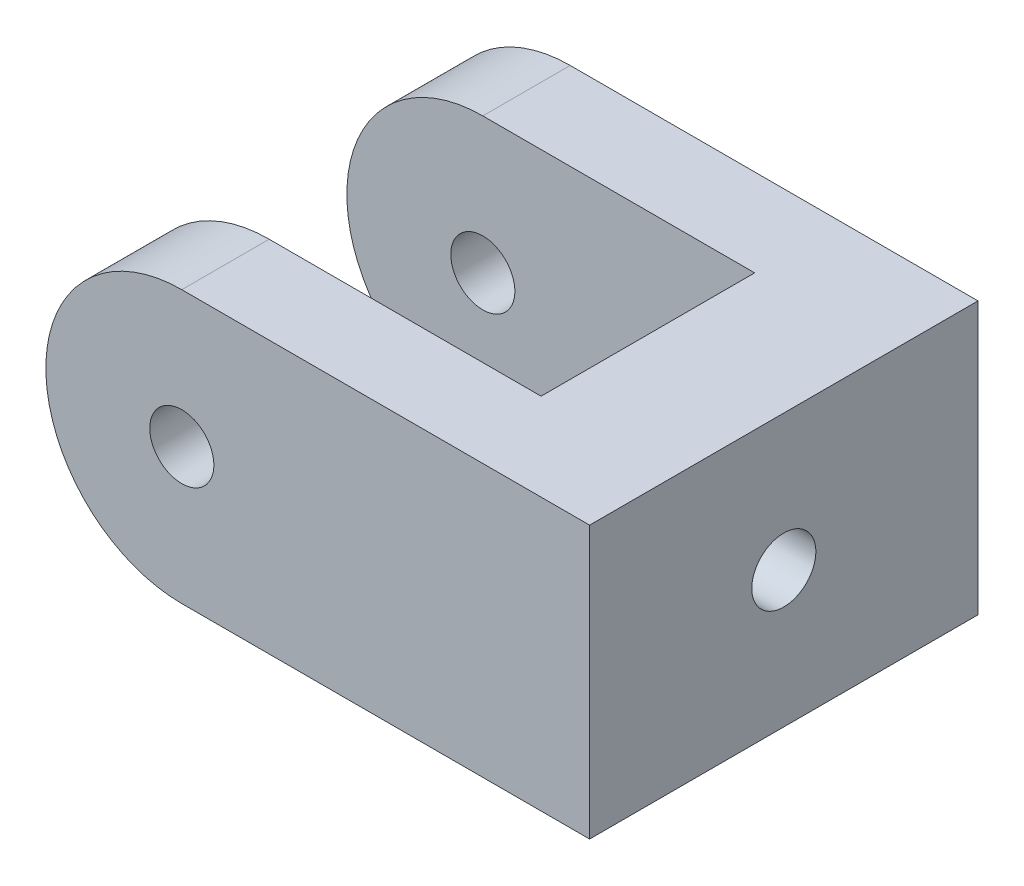
ISO-10303-21;
HEADER;
FILE_DESCRIPTION(('STEP AP214'),'2;1');
FILE_NAME('part.step','',(''),(''),'','','');
FILE_SCHEMA(('AUTOMOTIVE_DESIGN { 1 0 10303 214 1 1 1 1 }'));
ENDSEC;
DATA;
#1=APPLICATION_CONTEXT('core data for automotive mechanical design processes');
#2=APPLICATION_PROTOCOL_DEFINITION('international standard','automotive_design',2000,#1);
#3=PRODUCT_CONTEXT('',#1,'mechanical');
#4=PRODUCT('Part','Part','',(#3));
#5=PRODUCT_RELATED_PRODUCT_CATEGORY('part','',(#4));
#6=PRODUCT_DEFINITION_FORMATION('','',#4);
#7=PRODUCT_DEFINITION_CONTEXT('part definition',#1,'design');
#8=PRODUCT_DEFINITION('design','',#6,#7);
#9=PRODUCT_DEFINITION_SHAPE('','',#8);
#10=(LENGTH_UNIT() NAMED_UNIT(*) SI_UNIT(.MILLI.,.METRE.));
#11=(NAMED_UNIT(*) PLANE_ANGLE_UNIT() SI_UNIT($,.RADIAN.));
#12=(NAMED_UNIT(*) SI_UNIT($,.STERADIAN.) SOLID_ANGLE_UNIT());
#13=UNCERTAINTY_MEASURE_WITH_UNIT(LENGTH_MEASURE(1.E-05),#10,'distance_accuracy_value','');
#14=(GEOMETRIC_REPRESENTATION_CONTEXT(3) GLOBAL_UNCERTAINTY_ASSIGNED_CONTEXT((#13)) GLOBAL_UNIT_ASSIGNED_CONTEXT((#10,
#11,#12)) REPRESENTATION_CONTEXT('',''));
#15=CARTESIAN_POINT('',(0.,0.,0.));
#16=DIRECTION('',(0.,0.,1.));
#17=DIRECTION('',(1.,0.,0.));
#18=AXIS2_PLACEMENT_3D('',#15,#16,#17);
#19=CARTESIAN_POINT('',(14.,-7.,10.));
#20=DIRECTION('',(0.,1.,0.));
#21=DIRECTION('',(-1.,0.,0.));
#22=AXIS2_PLACEMENT_3D('',#19,#20,#21);
#23=PLANE('',#22);
#24=DIRECTION('',(-1.,0.,0.));
#25=VECTOR('',#24,1.);
#26=CARTESIAN_POINT('',(14.,-7.,-10.));
#27=LINE('',#26,#25);
#28=CARTESIAN_POINT('',(21.,-7.,-10.));
#29=VERTEX_POINT('',#28);
#30=CARTESIAN_POINT('',(0.,-7.,-10.));
#31=VERTEX_POINT('',#30);
#32=EDGE_CURVE('E129',#29,#31,#27,.T.);
#33=ORIENTED_EDGE('',*,*,#32,.F.);
#34=DIRECTION('',(0.,0.,1.));
#35=VECTOR('',#34,1.);
#36=CARTESIAN_POINT('',(21.,-7.,0.));
#37=LINE('',#36,#35);
#38=CARTESIAN_POINT('',(21.,-7.,10.));
#39=VERTEX_POINT('',#38);
#40=EDGE_CURVE('E45',#29,#39,#37,.T.);
#41=ORIENTED_EDGE('',*,*,#40,.T.);
#42=DIRECTION('',(-1.,0.,0.));
#43=VECTOR('',#42,1.);
#44=CARTESIAN_POINT('',(14.,-7.,10.));
#45=LINE('',#44,#43);
#46=CARTESIAN_POINT('',(0.,-7.,10.));
#47=VERTEX_POINT('',#46);
#48=EDGE_CURVE('E92',#47,#39,#45,.F.);
#49=ORIENTED_EDGE('',*,*,#48,.F.);
#50=DIRECTION('',(0.,0.,1.));
#51=VECTOR('',#50,1.);
#52=CARTESIAN_POINT('',(0.,-7.,10.));
#53=LINE('',#52,#51);
#54=CARTESIAN_POINT('',(0.,-7.,5.5));
#55=VERTEX_POINT('',#54);
#56=EDGE_CURVE('E103',#55,#47,#53,.T.);
#57=ORIENTED_EDGE('',*,*,#56,.F.);
#58=DIRECTION('',(-1.,0.,0.));
#59=VECTOR('',#58,1.);
#60=CARTESIAN_POINT('',(14.,-7.,5.5));
#61=LINE('',#60,#59);
#62=CARTESIAN_POINT('',(14.,-7.,5.5));
#63=VERTEX_POINT('',#62);
#64=EDGE_CURVE('E108',#63,#55,#61,.T.);
#65=ORIENTED_EDGE('',*,*,#64,.F.);
#66=DIRECTION('',(0.,0.,1.));
#67=VECTOR('',#66,1.);
#68=CARTESIAN_POINT('',(14.,-7.,10.));
#69=LINE('',#68,#67);
#70=CARTESIAN_POINT('',(14.,-7.,-5.5));
#71=VERTEX_POINT('',#70);
#72=EDGE_CURVE('E110',#71,#63,#69,.T.);
#73=ORIENTED_EDGE('',*,*,#72,.F.);
#74=DIRECTION('',(-1.,0.,0.));
#75=VECTOR('',#74,1.);
#76=CARTESIAN_POINT('',(14.,-7.,-5.5));
#77=LINE('',#76,#75);
#78=CARTESIAN_POINT('',(0.,-7.,-5.5));
#79=VERTEX_POINT('',#78);
#80=EDGE_CURVE('E119',#79,#71,#77,.F.);
#81=ORIENTED_EDGE('',*,*,#80,.F.);
#82=DIRECTION('',(0.,0.,1.));
#83=VECTOR('',#82,1.);
#84=CARTESIAN_POINT('',(0.,-7.,10.));
#85=LINE('',#84,#83);
#86=EDGE_CURVE('E124',#31,#79,#85,.T.);
#87=ORIENTED_EDGE('',*,*,#86,.F.);
#88=EDGE_LOOP('',(#33,#41,#49,#57,#65,#73,#81,#87));
#89=FACE_BOUND('',#88,.T.);
#90=ADVANCED_FACE('F36',(#89),#23,.F.);
#91=CARTESIAN_POINT('',(0.,7.,10.));
#92=DIRECTION('',(0.,-1.,0.));
#93=DIRECTION('',(1.,0.,0.));
#94=AXIS2_PLACEMENT_3D('',#91,#92,#93);
#95=PLANE('',#94);
#96=DIRECTION('',(0.,0.,1.));
#97=VECTOR('',#96,1.);
#98=CARTESIAN_POINT('',(21.,7.,0.));
#99=LINE('',#98,#97);
#100=CARTESIAN_POINT('',(21.,7.,10.));
#101=VERTEX_POINT('',#100);
#102=CARTESIAN_POINT('',(21.,7.,-10.));
#103=VERTEX_POINT('',#102);
#104=EDGE_CURVE('E11',#101,#103,#99,.F.);
#105=ORIENTED_EDGE('',*,*,#104,.T.);
#106=DIRECTION('',(1.,0.,0.));
#107=VECTOR('',#106,1.);
#108=CARTESIAN_POINT('',(0.,7.,-10.));
#109=LINE('',#108,#107);
#110=CARTESIAN_POINT('',(0.,7.,-10.));
#111=VERTEX_POINT('',#110);
#112=EDGE_CURVE('E227',#111,#103,#109,.T.);
#113=ORIENTED_EDGE('',*,*,#112,.F.);
#114=DIRECTION('',(0.,0.,1.));
#115=VECTOR('',#114,1.);
#116=CARTESIAN_POINT('',(0.,7.,10.));
#117=LINE('',#116,#115);
#118=CARTESIAN_POINT('',(0.,7.,-5.5));
#119=VERTEX_POINT('',#118);
#120=EDGE_CURVE('E233',#119,#111,#117,.F.);
#121=ORIENTED_EDGE('',*,*,#120,.F.);
#122=DIRECTION('',(1.,0.,0.));
#123=VECTOR('',#122,1.);
#124=CARTESIAN_POINT('',(0.,7.,-5.5));
#125=LINE('',#124,#123);
#126=CARTESIAN_POINT('',(14.,7.,-5.5));
#127=VERTEX_POINT('',#126);
#128=EDGE_CURVE('E238',#127,#119,#125,.F.);
#129=ORIENTED_EDGE('',*,*,#128,.F.);
#130=DIRECTION('',(0.,0.,1.));
#131=VECTOR('',#130,1.);
#132=CARTESIAN_POINT('',(14.,7.,10.));
#133=LINE('',#132,#131);
#134=CARTESIAN_POINT('',(14.,7.,5.5));
#135=VERTEX_POINT('',#134);
#136=EDGE_CURVE('E241',#135,#127,#133,.F.);
#137=ORIENTED_EDGE('',*,*,#136,.F.);
#138=DIRECTION('',(1.,0.,0.));
#139=VECTOR('',#138,1.);
#140=CARTESIAN_POINT('',(0.,7.,5.5));
#141=LINE('',#140,#139);
#142=CARTESIAN_POINT('',(0.,7.,5.5));
#143=VERTEX_POINT('',#142);
#144=EDGE_CURVE('E250',#143,#135,#141,.T.);
#145=ORIENTED_EDGE('',*,*,#144,.F.);
#146=DIRECTION('',(0.,0.,1.));
#147=VECTOR('',#146,1.);
#148=CARTESIAN_POINT('',(0.,7.,10.));
#149=LINE('',#148,#147);
#150=CARTESIAN_POINT('',(0.,7.,10.));
#151=VERTEX_POINT('',#150);
#152=EDGE_CURVE('E229',#151,#143,#149,.F.);
#153=ORIENTED_EDGE('',*,*,#152,.F.);
#154=DIRECTION('',(1.,0.,0.));
#155=VECTOR('',#154,1.);
#156=CARTESIAN_POINT('',(0.,7.,10.));
#157=LINE('',#156,#155);
#158=EDGE_CURVE('E95',#101,#151,#157,.F.);
#159=ORIENTED_EDGE('',*,*,#158,.F.);
#160=EDGE_LOOP('',(#105,#113,#121,#129,#137,#145,#153,#159));
#161=FACE_BOUND('',#160,.T.);
#162=ADVANCED_FACE('F165',(#161),#95,.F.);
#163=CARTESIAN_POINT('',(21.,0.,0.));
#164=DIRECTION('',(-1.,0.,0.));
#165=DIRECTION('',(0.,0.,1.));
#166=AXIS2_PLACEMENT_3D('',#163,#164,#165);
#167=PLANE('',#166);
#168=CARTESIAN_POINT('',(21.,0.,0.));
#169=DIRECTION('',(-1.,0.,0.));
#170=DIRECTION('',(0.,0.,1.));
#171=AXIS2_PLACEMENT_3D('',#168,#169,#170);
#172=CIRCLE('',#171,1.65);
#173=CARTESIAN_POINT('',(21.,0.,1.65));
#174=VERTEX_POINT('',#173);
#175=EDGE_CURVE('E214',#174,#174,#172,.T.);
#176=ORIENTED_EDGE('',*,*,#175,.T.);
#177=EDGE_LOOP('',(#176));
#178=FACE_BOUND('',#177,.T.);
#179=DIRECTION('',(0.,1.,0.));
#180=VECTOR('',#179,1.);
#181=CARTESIAN_POINT('',(21.,7.,-10.));
#182=LINE('',#181,#180);
#183=EDGE_CURVE('E219',#29,#103,#182,.T.);
#184=ORIENTED_EDGE('',*,*,#183,.T.);
#185=ORIENTED_EDGE('',*,*,#104,.F.);
#186=DIRECTION('',(0.,-1.,0.));
#187=VECTOR('',#186,1.);
#188=CARTESIAN_POINT('',(21.,7.,10.));
#189=LINE('',#188,#187);
#190=EDGE_CURVE('E224',#101,#39,#189,.T.);
#191=ORIENTED_EDGE('',*,*,#190,.T.);
#192=ORIENTED_EDGE('',*,*,#40,.F.);
#193=EDGE_LOOP('',(#184,#185,#191,#192));
#194=FACE_BOUND('',#193,.T.);
#195=ADVANCED_FACE('F170',(#178,#194),#167,.F.);
#196=CARTESIAN_POINT('',(0.,0.,10.));
#197=DIRECTION('',(0.,0.,-1.));
#198=DIRECTION('',(-1.,0.,0.));
#199=AXIS2_PLACEMENT_3D('',#196,#197,#198);
#200=CYLINDRICAL_SURFACE('',#199,1.65);
#201=CARTESIAN_POINT('',(0.,0.,5.5));
#202=DIRECTION('',(0.,0.,-1.));
#203=DIRECTION('',(-1.,0.,0.));
#204=AXIS2_PLACEMENT_3D('',#201,#202,#203);
#205=CIRCLE('',#204,1.65);
#206=CARTESIAN_POINT('',(-1.65,0.,5.5));
#207=VERTEX_POINT('',#206);
#208=EDGE_CURVE('E100',#207,#207,#205,.T.);
#209=ORIENTED_EDGE('',*,*,#208,.T.);
#210=EDGE_LOOP('',(#209));
#211=FACE_BOUND('',#210,.T.);
#212=CARTESIAN_POINT('',(0.,0.,10.));
#213=DIRECTION('',(0.,0.,-1.));
#214=DIRECTION('',(-1.,0.,0.));
#215=AXIS2_PLACEMENT_3D('',#212,#213,#214);
#216=CIRCLE('',#215,1.65);
#217=CARTESIAN_POINT('',(-1.65,0.,10.));
#218=VERTEX_POINT('',#217);
#219=EDGE_CURVE('E40',#218,#218,#216,.T.);
#220=ORIENTED_EDGE('',*,*,#219,.F.);
#221=EDGE_LOOP('',(#220));
#222=FACE_BOUND('',#221,.T.);
#223=ADVANCED_FACE('F38',(#211,#222),#200,.F.);
#224=CARTESIAN_POINT('',(0.,0.,10.));
#225=DIRECTION('',(0.,0.,-1.));
#226=DIRECTION('',(-1.,0.,0.));
#227=AXIS2_PLACEMENT_3D('',#224,#225,#226);
#228=CYLINDRICAL_SURFACE('',#227,1.65);
#229=CARTESIAN_POINT('',(0.,0.,-10.));
#230=DIRECTION('',(0.,0.,-1.));
#231=DIRECTION('',(-1.,0.,0.));
#232=AXIS2_PLACEMENT_3D('',#229,#230,#231);
#233=CIRCLE('',#232,1.65);
#234=CARTESIAN_POINT('',(-1.65,0.,-10.));
#235=VERTEX_POINT('',#234);
#236=EDGE_CURVE('E134',#235,#235,#233,.T.);
#237=ORIENTED_EDGE('',*,*,#236,.T.);
#238=EDGE_LOOP('',(#237));
#239=FACE_BOUND('',#238,.T.);
#240=CARTESIAN_POINT('',(0.,0.,-5.5));
#241=DIRECTION('',(0.,0.,-1.));
#242=DIRECTION('',(-1.,0.,0.));
#243=AXIS2_PLACEMENT_3D('',#240,#241,#242);
#244=CIRCLE('',#243,1.65);
#245=CARTESIAN_POINT('',(-1.65,0.,-5.5));
#246=VERTEX_POINT('',#245);
#247=EDGE_CURVE('E140',#246,#246,#244,.F.);
#248=ORIENTED_EDGE('',*,*,#247,.T.);
#249=EDGE_LOOP('',(#248));
#250=FACE_BOUND('',#249,.T.);
#251=ADVANCED_FACE('F192',(#239,#250),#228,.F.);
#252=CARTESIAN_POINT('',(0.,0.,10.));
#253=DIRECTION('',(0.,0.,1.));
#254=DIRECTION('',(1.,0.,0.));
#255=AXIS2_PLACEMENT_3D('',#252,#253,#254);
#256=PLANE('',#255);
#257=ORIENTED_EDGE('',*,*,#48,.T.);
#258=ORIENTED_EDGE('',*,*,#190,.F.);
#259=ORIENTED_EDGE('',*,*,#158,.T.);
#260=CARTESIAN_POINT('',(0.,0.,10.));
#261=DIRECTION('',(0.,0.,-1.));
#262=DIRECTION('',(-1.,0.,0.));
#263=AXIS2_PLACEMENT_3D('',#260,#261,#262);
#264=CIRCLE('',#263,7.);
#265=EDGE_CURVE('E88',#47,#151,#264,.T.);
#266=ORIENTED_EDGE('',*,*,#265,.F.);
#267=EDGE_LOOP('',(#257,#258,#259,#266));
#268=FACE_BOUND('',#267,.T.);
#269=ORIENTED_EDGE('',*,*,#219,.T.);
#270=EDGE_LOOP('',(#269));
#271=FACE_BOUND('',#270,.T.);
#272=ADVANCED_FACE('F89',(#268,#271),#256,.T.);
#273=CARTESIAN_POINT('',(0.,0.,10.));
#274=DIRECTION('',(0.,0.,-1.));
#275=DIRECTION('',(-1.,0.,0.));
#276=AXIS2_PLACEMENT_3D('',#273,#274,#275);
#277=CYLINDRICAL_SURFACE('',#276,7.);
#278=ORIENTED_EDGE('',*,*,#152,.T.);
#279=CARTESIAN_POINT('',(0.,0.,5.5));
#280=DIRECTION('',(0.,0.,-1.));
#281=DIRECTION('',(-1.,0.,0.));
#282=AXIS2_PLACEMENT_3D('',#279,#280,#281);
#283=CIRCLE('',#282,7.);
#284=EDGE_CURVE('E107',#143,#55,#283,.F.);
#285=ORIENTED_EDGE('',*,*,#284,.T.);
#286=ORIENTED_EDGE('',*,*,#56,.T.);
#287=ORIENTED_EDGE('',*,*,#265,.T.);
#288=EDGE_LOOP('',(#278,#285,#286,#287));
#289=FACE_BOUND('',#288,.T.);
#290=ADVANCED_FACE('F106',(#289),#277,.T.);
#291=CARTESIAN_POINT('',(-7.,-7.,5.5));
#292=DIRECTION('',(0.,0.,1.));
#293=DIRECTION('',(1.,0.,0.));
#294=AXIS2_PLACEMENT_3D('',#291,#292,#293);
#295=PLANE('',#294);
#296=DIRECTION('',(0.,1.,0.));
#297=VECTOR('',#296,1.);
#298=CARTESIAN_POINT('',(14.,0.,5.5));
#299=LINE('',#298,#297);
#300=EDGE_CURVE('E143',#63,#135,#299,.T.);
#301=ORIENTED_EDGE('',*,*,#300,.F.);
#302=ORIENTED_EDGE('',*,*,#64,.T.);
#303=ORIENTED_EDGE('',*,*,#284,.F.);
#304=ORIENTED_EDGE('',*,*,#144,.T.);
#305=EDGE_LOOP('',(#301,#302,#303,#304));
#306=FACE_BOUND('',#305,.T.);
#307=ORIENTED_EDGE('',*,*,#208,.F.);
#308=EDGE_LOOP('',(#307));
#309=FACE_BOUND('',#308,.T.);
#310=ADVANCED_FACE('F150',(#306,#309),#295,.F.);
#311=CARTESIAN_POINT('',(14.,0.,0.));
#312=DIRECTION('',(-1.,0.,0.));
#313=DIRECTION('',(0.,0.,1.));
#314=AXIS2_PLACEMENT_3D('',#311,#312,#313);
#315=PLANE('',#314);
#316=CARTESIAN_POINT('',(14.,0.,0.));
#317=DIRECTION('',(-1.,0.,0.));
#318=DIRECTION('',(0.,0.,1.));
#319=AXIS2_PLACEMENT_3D('',#316,#317,#318);
#320=CIRCLE('',#319,1.65);
#321=CARTESIAN_POINT('',(14.,0.,1.65));
#322=VERTEX_POINT('',#321);
#323=EDGE_CURVE('E217',#322,#322,#320,.T.);
#324=ORIENTED_EDGE('',*,*,#323,.F.);
#325=EDGE_LOOP('',(#324));
#326=FACE_BOUND('',#325,.T.);
#327=ORIENTED_EDGE('',*,*,#136,.T.);
#328=DIRECTION('',(0.,1.,0.));
#329=VECTOR('',#328,1.);
#330=CARTESIAN_POINT('',(14.,-7.,-5.5));
#331=LINE('',#330,#329);
#332=EDGE_CURVE('E139',#127,#71,#331,.F.);
#333=ORIENTED_EDGE('',*,*,#332,.T.);
#334=ORIENTED_EDGE('',*,*,#72,.T.);
#335=ORIENTED_EDGE('',*,*,#300,.T.);
#336=EDGE_LOOP('',(#327,#333,#334,#335));
#337=FACE_BOUND('',#336,.T.);
#338=ADVANCED_FACE('F152',(#326,#337),#315,.T.);
#339=CARTESIAN_POINT('',(-7.,-7.,-5.5));
#340=DIRECTION('',(0.,0.,-1.));
#341=DIRECTION('',(-1.,0.,0.));
#342=AXIS2_PLACEMENT_3D('',#339,#340,#341);
#343=PLANE('',#342);
#344=ORIENTED_EDGE('',*,*,#80,.T.);
#345=ORIENTED_EDGE('',*,*,#332,.F.);
#346=ORIENTED_EDGE('',*,*,#128,.T.);
#347=CARTESIAN_POINT('',(0.,0.,-5.5));
#348=DIRECTION('',(0.,0.,-1.));
#349=DIRECTION('',(-1.,0.,0.));
#350=AXIS2_PLACEMENT_3D('',#347,#348,#349);
#351=CIRCLE('',#350,7.);
#352=EDGE_CURVE('E137',#79,#119,#351,.T.);
#353=ORIENTED_EDGE('',*,*,#352,.F.);
#354=EDGE_LOOP('',(#344,#345,#346,#353));
#355=FACE_BOUND('',#354,.T.);
#356=ORIENTED_EDGE('',*,*,#247,.F.);
#357=EDGE_LOOP('',(#356));
#358=FACE_BOUND('',#357,.T.);
#359=ADVANCED_FACE('F159',(#355,#358),#343,.F.);
#360=CARTESIAN_POINT('',(0.,0.,10.));
#361=DIRECTION('',(0.,0.,-1.));
#362=DIRECTION('',(-1.,0.,0.));
#363=AXIS2_PLACEMENT_3D('',#360,#361,#362);
#364=CYLINDRICAL_SURFACE('',#363,7.);
#365=ORIENTED_EDGE('',*,*,#120,.T.);
#366=CARTESIAN_POINT('',(0.,0.,-10.));
#367=DIRECTION('',(0.,0.,-1.));
#368=DIRECTION('',(-1.,0.,0.));
#369=AXIS2_PLACEMENT_3D('',#366,#367,#368);
#370=CIRCLE('',#369,7.);
#371=EDGE_CURVE('E61',#111,#31,#370,.F.);
#372=ORIENTED_EDGE('',*,*,#371,.T.);
#373=ORIENTED_EDGE('',*,*,#86,.T.);
#374=ORIENTED_EDGE('',*,*,#352,.T.);
#375=EDGE_LOOP('',(#365,#372,#373,#374));
#376=FACE_BOUND('',#375,.T.);
#377=ADVANCED_FACE('F179',(#376),#364,.T.);
#378=CARTESIAN_POINT('',(0.,0.,-10.));
#379=DIRECTION('',(0.,0.,1.));
#380=DIRECTION('',(1.,0.,0.));
#381=AXIS2_PLACEMENT_3D('',#378,#379,#380);
#382=PLANE('',#381);
#383=ORIENTED_EDGE('',*,*,#183,.F.);
#384=ORIENTED_EDGE('',*,*,#32,.T.);
#385=ORIENTED_EDGE('',*,*,#371,.F.);
#386=ORIENTED_EDGE('',*,*,#112,.T.);
#387=EDGE_LOOP('',(#383,#384,#385,#386));
#388=FACE_BOUND('',#387,.T.);
#389=ORIENTED_EDGE('',*,*,#236,.F.);
#390=EDGE_LOOP('',(#389));
#391=FACE_BOUND('',#390,.T.);
#392=ADVANCED_FACE('F175',(#388,#391),#382,.F.);
#393=CARTESIAN_POINT('',(21.,0.,0.));
#394=DIRECTION('',(-1.,0.,0.));
#395=DIRECTION('',(0.,0.,1.));
#396=AXIS2_PLACEMENT_3D('',#393,#394,#395);
#397=CYLINDRICAL_SURFACE('',#396,1.65);
#398=ORIENTED_EDGE('',*,*,#175,.F.);
#399=EDGE_LOOP('',(#398));
#400=FACE_BOUND('',#399,.T.);
#401=ORIENTED_EDGE('',*,*,#323,.T.);
#402=EDGE_LOOP('',(#401));
#403=FACE_BOUND('',#402,.T.);
#404=ADVANCED_FACE('F178',(#400,#403),#397,.F.);
#405=CLOSED_SHELL('',(#90,#162,#195,#223,#251,#272,#290,#310,#338,#359,#377,#392,#404));
#406=MANIFOLD_SOLID_BREP('B2',#405);
#407=ADVANCED_BREP_SHAPE_REPRESENTATION('',(#18,#406),#14);
#408=SHAPE_DEFINITION_REPRESENTATION(#9,#407);
ENDSEC;
END-ISO-10303-21;
